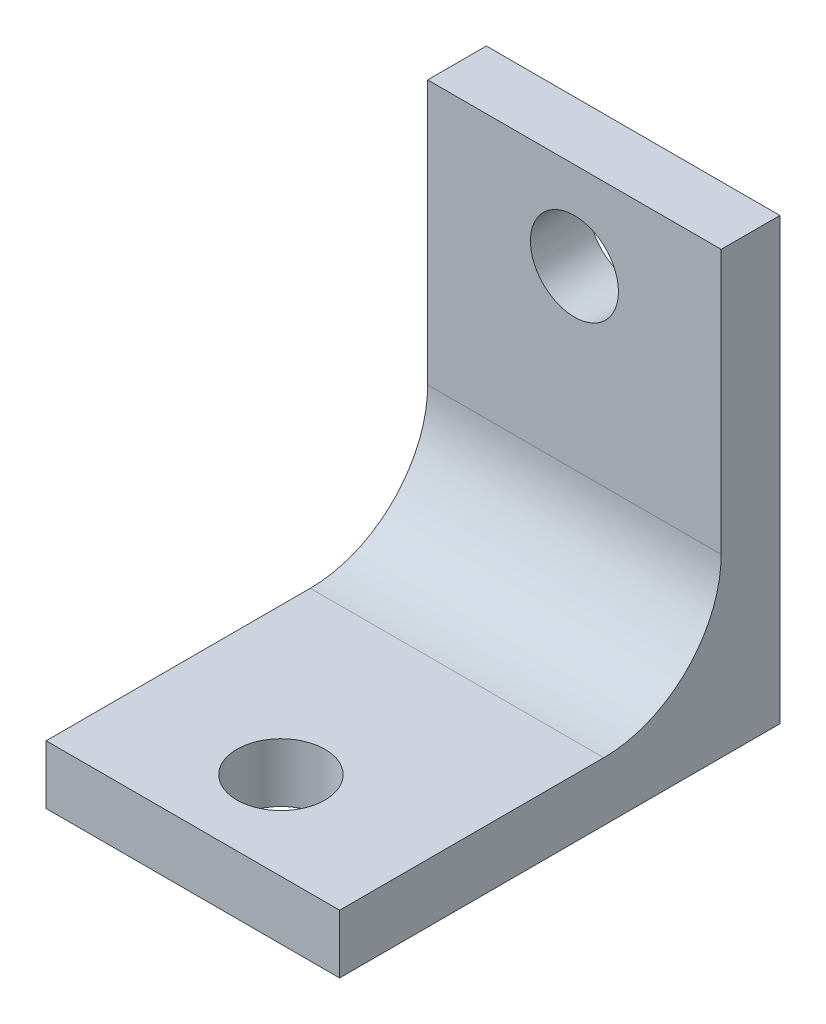
ISO-10303-21;
HEADER;
FILE_DESCRIPTION(('STEP AP214'),'2;1');
FILE_NAME('part.step','',(''),(''),'','','');
FILE_SCHEMA(('AUTOMOTIVE_DESIGN { 1 0 10303 214 1 1 1 1 }'));
ENDSEC;
DATA;
#1=APPLICATION_CONTEXT('core data for automotive mechanical design processes');
#2=APPLICATION_PROTOCOL_DEFINITION('international standard','automotive_design',2000,#1);
#3=PRODUCT_CONTEXT('',#1,'mechanical');
#4=PRODUCT('Part','Part','',(#3));
#5=PRODUCT_RELATED_PRODUCT_CATEGORY('part','',(#4));
#6=PRODUCT_DEFINITION_FORMATION('','',#4);
#7=PRODUCT_DEFINITION_CONTEXT('part definition',#1,'design');
#8=PRODUCT_DEFINITION('design','',#6,#7);
#9=PRODUCT_DEFINITION_SHAPE('','',#8);
#10=(LENGTH_UNIT() NAMED_UNIT(*) SI_UNIT(.MILLI.,.METRE.));
#11=(NAMED_UNIT(*) PLANE_ANGLE_UNIT() SI_UNIT($,.RADIAN.));
#12=(NAMED_UNIT(*) SI_UNIT($,.STERADIAN.) SOLID_ANGLE_UNIT());
#13=UNCERTAINTY_MEASURE_WITH_UNIT(LENGTH_MEASURE(1.E-05),#10,'distance_accuracy_value','');
#14=(GEOMETRIC_REPRESENTATION_CONTEXT(3) GLOBAL_UNCERTAINTY_ASSIGNED_CONTEXT((#13)) GLOBAL_UNIT_ASSIGNED_CONTEXT((#10,
#11,#12)) REPRESENTATION_CONTEXT('',''));
#15=CARTESIAN_POINT('',(0.,0.,0.));
#16=DIRECTION('',(0.,0.,1.));
#17=DIRECTION('',(1.,0.,0.));
#18=AXIS2_PLACEMENT_3D('',#15,#16,#17);
#19=CARTESIAN_POINT('',(10.,0.,15.));
#20=DIRECTION('',(0.,1.,0.));
#21=DIRECTION('',(0.,0.,1.));
#22=AXIS2_PLACEMENT_3D('',#19,#20,#21);
#23=PLANE('',#22);
#24=CARTESIAN_POINT('',(5.,0.,12.));
#25=DIRECTION('',(0.,1.,0.));
#26=DIRECTION('',(0.,0.,1.));
#27=AXIS2_PLACEMENT_3D('',#24,#25,#26);
#28=CIRCLE('',#27,1.5);
#29=CARTESIAN_POINT('',(5.,0.,13.5));
#30=VERTEX_POINT('',#29);
#31=EDGE_CURVE('E154',#30,#30,#28,.T.);
#32=ORIENTED_EDGE('',*,*,#31,.T.);
#33=EDGE_LOOP('',(#32));
#34=FACE_BOUND('',#33,.T.);
#35=DIRECTION('',(0.,0.,-1.));
#36=VECTOR('',#35,1.);
#37=CARTESIAN_POINT('',(0.,0.,15.));
#38=LINE('',#37,#36);
#39=CARTESIAN_POINT('',(0.,0.,15.));
#40=VERTEX_POINT('',#39);
#41=CARTESIAN_POINT('',(0.,0.,0.));
#42=VERTEX_POINT('',#41);
#43=EDGE_CURVE('E116',#40,#42,#38,.T.);
#44=ORIENTED_EDGE('',*,*,#43,.T.);
#45=DIRECTION('',(-1.,0.,0.));
#46=VECTOR('',#45,1.);
#47=CARTESIAN_POINT('',(10.,0.,0.));
#48=LINE('',#47,#46);
#49=CARTESIAN_POINT('',(10.,0.,0.));
#50=VERTEX_POINT('',#49);
#51=EDGE_CURVE('E97',#50,#42,#48,.T.);
#52=ORIENTED_EDGE('',*,*,#51,.F.);
#53=DIRECTION('',(0.,0.,-1.));
#54=VECTOR('',#53,1.);
#55=CARTESIAN_POINT('',(10.,0.,15.));
#56=LINE('',#55,#54);
#57=CARTESIAN_POINT('',(10.,0.,15.));
#58=VERTEX_POINT('',#57);
#59=EDGE_CURVE('E104',#58,#50,#56,.T.);
#60=ORIENTED_EDGE('',*,*,#59,.F.);
#61=DIRECTION('',(-1.,0.,0.));
#62=VECTOR('',#61,1.);
#63=CARTESIAN_POINT('',(10.,0.,15.));
#64=LINE('',#63,#62);
#65=EDGE_CURVE('E130',#58,#40,#64,.T.);
#66=ORIENTED_EDGE('',*,*,#65,.T.);
#67=EDGE_LOOP('',(#44,#52,#60,#66));
#68=FACE_BOUND('',#67,.T.);
#69=ADVANCED_FACE('F34',(#34,#68),#23,.F.);
#70=CARTESIAN_POINT('',(10.,0.,0.));
#71=DIRECTION('',(0.,0.,1.));
#72=DIRECTION('',(1.,0.,0.));
#73=AXIS2_PLACEMENT_3D('',#70,#71,#72);
#74=PLANE('',#73);
#75=CARTESIAN_POINT('',(5.,12.,0.));
#76=DIRECTION('',(0.,0.,1.));
#77=DIRECTION('',(1.,0.,0.));
#78=AXIS2_PLACEMENT_3D('',#75,#76,#77);
#79=CIRCLE('',#78,1.5);
#80=CARTESIAN_POINT('',(6.5,12.,0.));
#81=VERTEX_POINT('',#80);
#82=EDGE_CURVE('E142',#81,#81,#79,.T.);
#83=ORIENTED_EDGE('',*,*,#82,.T.);
#84=EDGE_LOOP('',(#83));
#85=FACE_BOUND('',#84,.T.);
#86=DIRECTION('',(0.,1.,0.));
#87=VECTOR('',#86,1.);
#88=CARTESIAN_POINT('',(0.,0.,0.));
#89=LINE('',#88,#87);
#90=CARTESIAN_POINT('',(0.,15.,0.));
#91=VERTEX_POINT('',#90);
#92=EDGE_CURVE('E139',#42,#91,#89,.T.);
#93=ORIENTED_EDGE('',*,*,#92,.T.);
#94=DIRECTION('',(-1.,0.,0.));
#95=VECTOR('',#94,1.);
#96=CARTESIAN_POINT('',(10.,15.,0.));
#97=LINE('',#96,#95);
#98=CARTESIAN_POINT('',(10.,15.,0.));
#99=VERTEX_POINT('',#98);
#100=EDGE_CURVE('E100',#99,#91,#97,.T.);
#101=ORIENTED_EDGE('',*,*,#100,.F.);
#102=DIRECTION('',(0.,1.,0.));
#103=VECTOR('',#102,1.);
#104=CARTESIAN_POINT('',(10.,0.,0.));
#105=LINE('',#104,#103);
#106=EDGE_CURVE('E93',#50,#99,#105,.T.);
#107=ORIENTED_EDGE('',*,*,#106,.F.);
#108=ORIENTED_EDGE('',*,*,#51,.T.);
#109=EDGE_LOOP('',(#93,#101,#107,#108));
#110=FACE_BOUND('',#109,.T.);
#111=ADVANCED_FACE('F95',(#85,#110),#74,.F.);
#112=CARTESIAN_POINT('',(10.,15.,0.));
#113=DIRECTION('',(0.,-1.,0.));
#114=DIRECTION('',(0.,0.,-1.));
#115=AXIS2_PLACEMENT_3D('',#112,#113,#114);
#116=PLANE('',#115);
#117=DIRECTION('',(0.,0.,1.));
#118=VECTOR('',#117,1.);
#119=CARTESIAN_POINT('',(0.,15.,0.));
#120=LINE('',#119,#118);
#121=CARTESIAN_POINT('',(0.,15.,2.));
#122=VERTEX_POINT('',#121);
#123=EDGE_CURVE('E137',#91,#122,#120,.T.);
#124=ORIENTED_EDGE('',*,*,#123,.T.);
#125=DIRECTION('',(-1.,0.,0.));
#126=VECTOR('',#125,1.);
#127=CARTESIAN_POINT('',(10.,15.,2.));
#128=LINE('',#127,#126);
#129=CARTESIAN_POINT('',(10.,15.,2.));
#130=VERTEX_POINT('',#129);
#131=EDGE_CURVE('E121',#130,#122,#128,.T.);
#132=ORIENTED_EDGE('',*,*,#131,.F.);
#133=DIRECTION('',(0.,0.,1.));
#134=VECTOR('',#133,1.);
#135=CARTESIAN_POINT('',(10.,15.,0.));
#136=LINE('',#135,#134);
#137=EDGE_CURVE('E103',#99,#130,#136,.T.);
#138=ORIENTED_EDGE('',*,*,#137,.F.);
#139=ORIENTED_EDGE('',*,*,#100,.T.);
#140=EDGE_LOOP('',(#124,#132,#138,#139));
#141=FACE_BOUND('',#140,.T.);
#142=ADVANCED_FACE('F179',(#141),#116,.F.);
#143=CARTESIAN_POINT('',(10.,15.,2.));
#144=DIRECTION('',(0.,0.,-1.));
#145=DIRECTION('',(0.,1.,0.));
#146=AXIS2_PLACEMENT_3D('',#143,#144,#145);
#147=PLANE('',#146);
#148=CARTESIAN_POINT('',(5.,12.,2.));
#149=DIRECTION('',(0.,0.,1.));
#150=DIRECTION('',(1.,0.,0.));
#151=AXIS2_PLACEMENT_3D('',#148,#149,#150);
#152=CIRCLE('',#151,1.5);
#153=CARTESIAN_POINT('',(6.5,12.,2.));
#154=VERTEX_POINT('',#153);
#155=EDGE_CURVE('E151',#154,#154,#152,.T.);
#156=ORIENTED_EDGE('',*,*,#155,.F.);
#157=EDGE_LOOP('',(#156));
#158=FACE_BOUND('',#157,.T.);
#159=DIRECTION('',(0.,-1.,0.));
#160=VECTOR('',#159,1.);
#161=CARTESIAN_POINT('',(0.,15.,2.));
#162=LINE('',#161,#160);
#163=CARTESIAN_POINT('',(0.,6.,2.));
#164=VERTEX_POINT('',#163);
#165=EDGE_CURVE('E135',#122,#164,#162,.T.);
#166=ORIENTED_EDGE('',*,*,#165,.T.);
#167=DIRECTION('',(-1.,0.,0.));
#168=VECTOR('',#167,1.);
#169=CARTESIAN_POINT('',(10.,6.,2.));
#170=LINE('',#169,#168);
#171=CARTESIAN_POINT('',(10.,6.,2.));
#172=VERTEX_POINT('',#171);
#173=EDGE_CURVE('E49',#164,#172,#170,.F.);
#174=ORIENTED_EDGE('',*,*,#173,.T.);
#175=DIRECTION('',(0.,-1.,0.));
#176=VECTOR('',#175,1.);
#177=CARTESIAN_POINT('',(10.,15.,2.));
#178=LINE('',#177,#176);
#179=EDGE_CURVE('E146',#130,#172,#178,.T.);
#180=ORIENTED_EDGE('',*,*,#179,.F.);
#181=ORIENTED_EDGE('',*,*,#131,.T.);
#182=EDGE_LOOP('',(#166,#174,#180,#181));
#183=FACE_BOUND('',#182,.T.);
#184=ADVANCED_FACE('F168',(#158,#183),#147,.F.);
#185=CARTESIAN_POINT('',(10.,2.,2.));
#186=DIRECTION('',(0.,-1.,0.));
#187=DIRECTION('',(0.,0.,-1.));
#188=AXIS2_PLACEMENT_3D('',#185,#186,#187);
#189=PLANE('',#188);
#190=CARTESIAN_POINT('',(5.,2.,12.));
#191=DIRECTION('',(0.,1.,0.));
#192=DIRECTION('',(0.,0.,1.));
#193=AXIS2_PLACEMENT_3D('',#190,#191,#192);
#194=CIRCLE('',#193,1.5);
#195=CARTESIAN_POINT('',(5.,2.,13.5));
#196=VERTEX_POINT('',#195);
#197=EDGE_CURVE('E157',#196,#196,#194,.T.);
#198=ORIENTED_EDGE('',*,*,#197,.F.);
#199=EDGE_LOOP('',(#198));
#200=FACE_BOUND('',#199,.T.);
#201=DIRECTION('',(0.,0.,1.));
#202=VECTOR('',#201,1.);
#203=CARTESIAN_POINT('',(10.,2.,2.));
#204=LINE('',#203,#202);
#205=CARTESIAN_POINT('',(10.,2.,6.));
#206=VERTEX_POINT('',#205);
#207=CARTESIAN_POINT('',(10.,2.,15.));
#208=VERTEX_POINT('',#207);
#209=EDGE_CURVE('E144',#206,#208,#204,.T.);
#210=ORIENTED_EDGE('',*,*,#209,.F.);
#211=DIRECTION('',(-1.,0.,0.));
#212=VECTOR('',#211,1.);
#213=CARTESIAN_POINT('',(0.,2.,6.));
#214=LINE('',#213,#212);
#215=CARTESIAN_POINT('',(0.,2.,6.));
#216=VERTEX_POINT('',#215);
#217=EDGE_CURVE('E117',#206,#216,#214,.T.);
#218=ORIENTED_EDGE('',*,*,#217,.T.);
#219=DIRECTION('',(0.,0.,1.));
#220=VECTOR('',#219,1.);
#221=CARTESIAN_POINT('',(0.,2.,2.));
#222=LINE('',#221,#220);
#223=CARTESIAN_POINT('',(0.,2.,15.));
#224=VERTEX_POINT('',#223);
#225=EDGE_CURVE('E133',#216,#224,#222,.T.);
#226=ORIENTED_EDGE('',*,*,#225,.T.);
#227=DIRECTION('',(-1.,0.,0.));
#228=VECTOR('',#227,1.);
#229=CARTESIAN_POINT('',(10.,2.,15.));
#230=LINE('',#229,#228);
#231=EDGE_CURVE('E127',#208,#224,#230,.T.);
#232=ORIENTED_EDGE('',*,*,#231,.F.);
#233=EDGE_LOOP('',(#210,#218,#226,#232));
#234=FACE_BOUND('',#233,.T.);
#235=ADVANCED_FACE('F164',(#200,#234),#189,.F.);
#236=CARTESIAN_POINT('',(10.,2.,15.));
#237=DIRECTION('',(0.,0.,-1.));
#238=DIRECTION('',(-1.,0.,0.));
#239=AXIS2_PLACEMENT_3D('',#236,#237,#238);
#240=PLANE('',#239);
#241=DIRECTION('',(0.,-1.,0.));
#242=VECTOR('',#241,1.);
#243=CARTESIAN_POINT('',(0.,2.,15.));
#244=LINE('',#243,#242);
#245=EDGE_CURVE('E113',#224,#40,#244,.T.);
#246=ORIENTED_EDGE('',*,*,#245,.T.);
#247=ORIENTED_EDGE('',*,*,#65,.F.);
#248=DIRECTION('',(0.,-1.,0.));
#249=VECTOR('',#248,1.);
#250=CARTESIAN_POINT('',(10.,2.,15.));
#251=LINE('',#250,#249);
#252=EDGE_CURVE('E109',#208,#58,#251,.T.);
#253=ORIENTED_EDGE('',*,*,#252,.F.);
#254=ORIENTED_EDGE('',*,*,#231,.T.);
#255=EDGE_LOOP('',(#246,#247,#253,#254));
#256=FACE_BOUND('',#255,.T.);
#257=ADVANCED_FACE('F167',(#256),#240,.F.);
#258=CARTESIAN_POINT('',(10.,0.,0.));
#259=DIRECTION('',(1.,0.,0.));
#260=DIRECTION('',(0.,0.,-1.));
#261=AXIS2_PLACEMENT_3D('',#258,#259,#260);
#262=PLANE('',#261);
#263=ORIENTED_EDGE('',*,*,#59,.T.);
#264=ORIENTED_EDGE('',*,*,#106,.T.);
#265=ORIENTED_EDGE('',*,*,#137,.T.);
#266=ORIENTED_EDGE('',*,*,#179,.T.);
#267=CARTESIAN_POINT('',(10.,6.,6.));
#268=DIRECTION('',(1.,0.,0.));
#269=DIRECTION('',(0.,0.,-1.));
#270=AXIS2_PLACEMENT_3D('',#267,#268,#269);
#271=CIRCLE('',#270,4.);
#272=EDGE_CURVE('E11',#172,#206,#271,.F.);
#273=ORIENTED_EDGE('',*,*,#272,.T.);
#274=ORIENTED_EDGE('',*,*,#209,.T.);
#275=ORIENTED_EDGE('',*,*,#252,.T.);
#276=EDGE_LOOP('',(#263,#264,#265,#266,#273,#274,#275));
#277=FACE_BOUND('',#276,.T.);
#278=ADVANCED_FACE('F107',(#277),#262,.T.);
#279=CARTESIAN_POINT('',(0.,0.,0.));
#280=DIRECTION('',(1.,0.,0.));
#281=DIRECTION('',(0.,0.,-1.));
#282=AXIS2_PLACEMENT_3D('',#279,#280,#281);
#283=PLANE('',#282);
#284=ORIENTED_EDGE('',*,*,#43,.F.);
#285=ORIENTED_EDGE('',*,*,#245,.F.);
#286=ORIENTED_EDGE('',*,*,#225,.F.);
#287=CARTESIAN_POINT('',(0.,6.,6.));
#288=DIRECTION('',(1.,0.,0.));
#289=DIRECTION('',(0.,0.,-1.));
#290=AXIS2_PLACEMENT_3D('',#287,#288,#289);
#291=CIRCLE('',#290,4.);
#292=EDGE_CURVE('E42',#216,#164,#291,.T.);
#293=ORIENTED_EDGE('',*,*,#292,.T.);
#294=ORIENTED_EDGE('',*,*,#165,.F.);
#295=ORIENTED_EDGE('',*,*,#123,.F.);
#296=ORIENTED_EDGE('',*,*,#92,.F.);
#297=EDGE_LOOP('',(#284,#285,#286,#293,#294,#295,#296));
#298=FACE_BOUND('',#297,.T.);
#299=ADVANCED_FACE('F178',(#298),#283,.F.);
#300=CARTESIAN_POINT('',(5.,12.,-8.));
#301=DIRECTION('',(0.,0.,1.));
#302=DIRECTION('',(1.,0.,0.));
#303=AXIS2_PLACEMENT_3D('',#300,#301,#302);
#304=CYLINDRICAL_SURFACE('',#303,1.5);
#305=ORIENTED_EDGE('',*,*,#155,.T.);
#306=EDGE_LOOP('',(#305));
#307=FACE_BOUND('',#306,.T.);
#308=ORIENTED_EDGE('',*,*,#82,.F.);
#309=EDGE_LOOP('',(#308));
#310=FACE_BOUND('',#309,.T.);
#311=ADVANCED_FACE('F196',(#307,#310),#304,.F.);
#312=CARTESIAN_POINT('',(5.,-8.,12.));
#313=DIRECTION('',(0.,1.,0.));
#314=DIRECTION('',(0.,0.,1.));
#315=AXIS2_PLACEMENT_3D('',#312,#313,#314);
#316=CYLINDRICAL_SURFACE('',#315,1.5);
#317=ORIENTED_EDGE('',*,*,#197,.T.);
#318=EDGE_LOOP('',(#317));
#319=FACE_BOUND('',#318,.T.);
#320=ORIENTED_EDGE('',*,*,#31,.F.);
#321=EDGE_LOOP('',(#320));
#322=FACE_BOUND('',#321,.T.);
#323=ADVANCED_FACE('F161',(#319,#322),#316,.F.);
#324=CARTESIAN_POINT('',(10.,6.,6.));
#325=DIRECTION('',(1.,0.,0.));
#326=DIRECTION('',(0.,0.,-1.));
#327=AXIS2_PLACEMENT_3D('',#324,#325,#326);
#328=CYLINDRICAL_SURFACE('',#327,4.);
#329=ORIENTED_EDGE('',*,*,#272,.F.);
#330=ORIENTED_EDGE('',*,*,#173,.F.);
#331=ORIENTED_EDGE('',*,*,#292,.F.);
#332=ORIENTED_EDGE('',*,*,#217,.F.);
#333=EDGE_LOOP('',(#329,#330,#331,#332));
#334=FACE_BOUND('',#333,.T.);
#335=ADVANCED_FACE('F36',(#334),#328,.F.);
#336=CLOSED_SHELL('',(#69,#111,#142,#184,#235,#257,#278,#299,#311,#323,#335));
#337=MANIFOLD_SOLID_BREP('B2',#336);
#338=ADVANCED_BREP_SHAPE_REPRESENTATION('',(#18,#337),#14);
#339=SHAPE_DEFINITION_REPRESENTATION(#9,#338);
ENDSEC;
END-ISO-10303-21;
